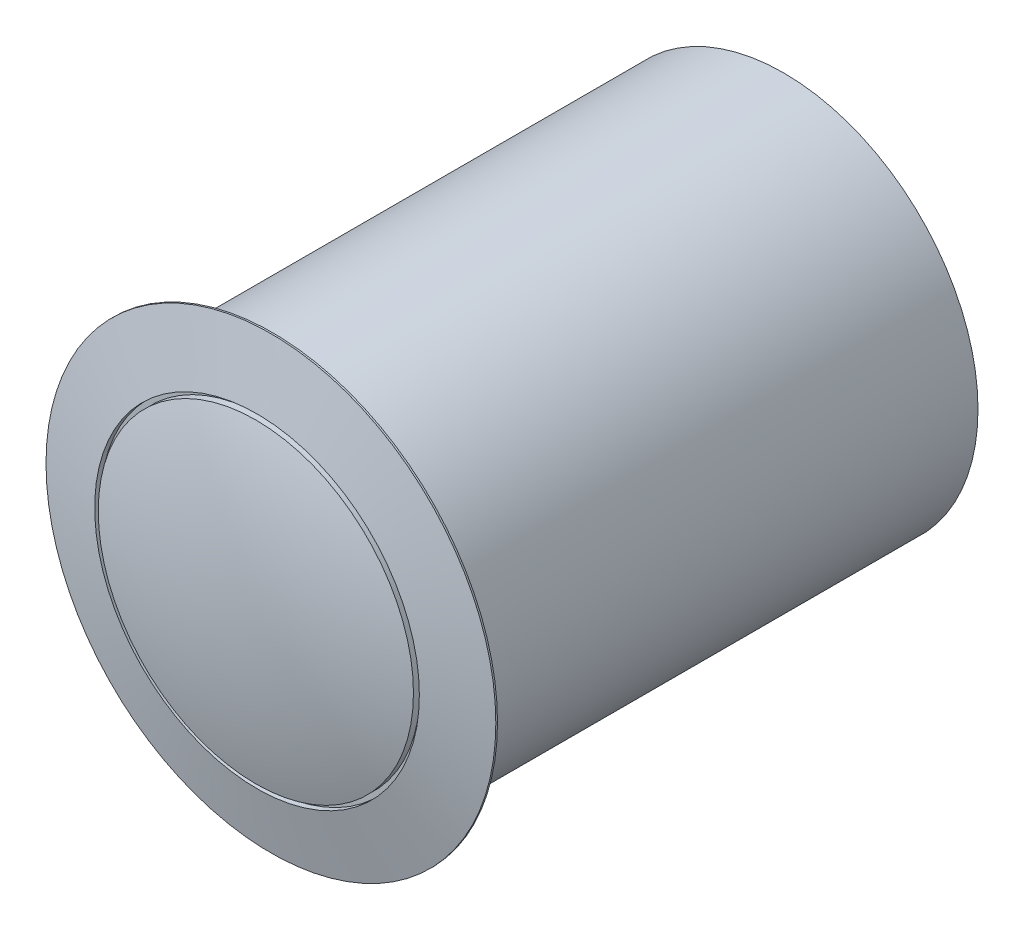
ISO-10303-21;
HEADER;
FILE_DESCRIPTION(('STEP AP214'),'2;1');
FILE_NAME('part.step','',(''),(''),'','','');
FILE_SCHEMA(('AUTOMOTIVE_DESIGN { 1 0 10303 214 1 1 1 1 }'));
ENDSEC;
DATA;
#1=APPLICATION_CONTEXT('core data for automotive mechanical design processes');
#2=APPLICATION_PROTOCOL_DEFINITION('international standard','automotive_design',2000,#1);
#3=PRODUCT_CONTEXT('',#1,'mechanical');
#4=PRODUCT('Part','Part','',(#3));
#5=PRODUCT_RELATED_PRODUCT_CATEGORY('part','',(#4));
#6=PRODUCT_DEFINITION_FORMATION('','',#4);
#7=PRODUCT_DEFINITION_CONTEXT('part definition',#1,'design');
#8=PRODUCT_DEFINITION('design','',#6,#7);
#9=PRODUCT_DEFINITION_SHAPE('','',#8);
#10=(LENGTH_UNIT() NAMED_UNIT(*) SI_UNIT(.MILLI.,.METRE.));
#11=(NAMED_UNIT(*) PLANE_ANGLE_UNIT() SI_UNIT($,.RADIAN.));
#12=(NAMED_UNIT(*) SI_UNIT($,.STERADIAN.) SOLID_ANGLE_UNIT());
#13=UNCERTAINTY_MEASURE_WITH_UNIT(LENGTH_MEASURE(1.E-05),#10,'distance_accuracy_value','');
#14=(GEOMETRIC_REPRESENTATION_CONTEXT(3) GLOBAL_UNCERTAINTY_ASSIGNED_CONTEXT((#13)) GLOBAL_UNIT_ASSIGNED_CONTEXT((#10,
#11,#12)) REPRESENTATION_CONTEXT('',''));
#15=CARTESIAN_POINT('',(0.,0.,0.));
#16=DIRECTION('',(0.,0.,1.));
#17=DIRECTION('',(1.,0.,0.));
#18=AXIS2_PLACEMENT_3D('',#15,#16,#17);
#19=CARTESIAN_POINT('',(0.,0.,3.38108067372266));
#20=DIRECTION('',(0.,0.,1.));
#21=DIRECTION('',(1.,0.,0.));
#22=AXIS2_PLACEMENT_3D('',#19,#20,#21);
#23=CYLINDRICAL_SURFACE('',#22,7.93920724566988);
#24=CARTESIAN_POINT('',(0.,0.,0.761243377894516));
#25=DIRECTION('',(0.,0.,1.));
#26=DIRECTION('',(1.,0.,0.));
#27=AXIS2_PLACEMENT_3D('',#24,#25,#26);
#28=CIRCLE('',#27,7.93920724566988);
#29=CARTESIAN_POINT('',(7.93920724566988,0.,0.761243377894516));
#30=VERTEX_POINT('',#29);
#31=EDGE_CURVE('E10',#30,#30,#28,.T.);
#32=ORIENTED_EDGE('',*,*,#31,.T.);
#33=EDGE_LOOP('',(#32));
#34=FACE_BOUND('',#33,.T.);
#35=CARTESIAN_POINT('',(0.,0.,0.488101593054619));
#36=DIRECTION('',(0.,0.,1.));
#37=DIRECTION('',(1.,0.,0.));
#38=AXIS2_PLACEMENT_3D('',#35,#36,#37);
#39=CIRCLE('',#38,7.93920724566988);
#40=CARTESIAN_POINT('',(7.93920724566988,0.,0.488101593054619));
#41=VERTEX_POINT('',#40);
#42=EDGE_CURVE('E59',#41,#41,#39,.T.);
#43=ORIENTED_EDGE('',*,*,#42,.F.);
#44=EDGE_LOOP('',(#43));
#45=FACE_BOUND('',#44,.T.);
#46=ADVANCED_FACE('F31',(#34,#45),#23,.F.);
#47=CARTESIAN_POINT('',(0.,0.,0.761243377894516));
#48=DIRECTION('',(0.,0.,-1.));
#49=DIRECTION('',(-1.,0.,0.));
#50=AXIS2_PLACEMENT_3D('',#47,#48,#49);
#51=CONICAL_SURFACE('',#50,7.93920724566988,1.35245152850808);
#52=CARTESIAN_POINT('',(0.,0.,0.0821082788888816));
#53=DIRECTION('',(0.,0.,1.));
#54=DIRECTION('',(1.,0.,0.));
#55=AXIS2_PLACEMENT_3D('',#52,#53,#54);
#56=CIRCLE('',#55,11.);
#57=CARTESIAN_POINT('',(11.,0.,0.0821082788888816));
#58=VERTEX_POINT('',#57);
#59=EDGE_CURVE('E37',#58,#58,#56,.T.);
#60=ORIENTED_EDGE('',*,*,#59,.T.);
#61=EDGE_LOOP('',(#60));
#62=FACE_BOUND('',#61,.T.);
#63=ORIENTED_EDGE('',*,*,#31,.F.);
#64=EDGE_LOOP('',(#63));
#65=FACE_BOUND('',#64,.T.);
#66=ADVANCED_FACE('F67',(#62,#65),#51,.T.);
#67=CARTESIAN_POINT('',(0.,0.,3.38108067372266));
#68=DIRECTION('',(0.,0.,1.));
#69=DIRECTION('',(1.,0.,0.));
#70=AXIS2_PLACEMENT_3D('',#67,#68,#69);
#71=CYLINDRICAL_SURFACE('',#70,11.);
#72=CARTESIAN_POINT('',(0.,0.,0.));
#73=DIRECTION('',(0.,0.,1.));
#74=DIRECTION('',(1.,0.,0.));
#75=AXIS2_PLACEMENT_3D('',#72,#73,#74);
#76=CIRCLE('',#75,11.);
#77=CARTESIAN_POINT('',(11.,0.,0.));
#78=VERTEX_POINT('',#77);
#79=EDGE_CURVE('E41',#78,#78,#76,.T.);
#80=ORIENTED_EDGE('',*,*,#79,.T.);
#81=EDGE_LOOP('',(#80));
#82=FACE_BOUND('',#81,.T.);
#83=ORIENTED_EDGE('',*,*,#59,.F.);
#84=EDGE_LOOP('',(#83));
#85=FACE_BOUND('',#84,.T.);
#86=ADVANCED_FACE('F71',(#82,#85),#71,.T.);
#87=CARTESIAN_POINT('',(11.,0.,0.));
#88=DIRECTION('',(0.,0.,-1.));
#89=DIRECTION('',(-1.,0.,0.));
#90=AXIS2_PLACEMENT_3D('',#87,#88,#89);
#91=PLANE('',#90);
#92=CARTESIAN_POINT('',(0.,0.,0.));
#93=DIRECTION('',(0.,0.,1.));
#94=DIRECTION('',(1.,0.,0.));
#95=AXIS2_PLACEMENT_3D('',#92,#93,#94);
#96=CIRCLE('',#95,9.5);
#97=CARTESIAN_POINT('',(9.5,0.,0.));
#98=VERTEX_POINT('',#97);
#99=EDGE_CURVE('E45',#98,#98,#96,.T.);
#100=ORIENTED_EDGE('',*,*,#99,.T.);
#101=EDGE_LOOP('',(#100));
#102=FACE_BOUND('',#101,.T.);
#103=ORIENTED_EDGE('',*,*,#79,.F.);
#104=EDGE_LOOP('',(#103));
#105=FACE_BOUND('',#104,.T.);
#106=ADVANCED_FACE('F75',(#102,#105),#91,.T.);
#107=CARTESIAN_POINT('',(0.,0.,3.38108067372266));
#108=DIRECTION('',(0.,0.,1.));
#109=DIRECTION('',(1.,0.,0.));
#110=AXIS2_PLACEMENT_3D('',#107,#108,#109);
#111=CYLINDRICAL_SURFACE('',#110,9.5);
#112=CARTESIAN_POINT('',(0.,0.,-25.));
#113=DIRECTION('',(0.,0.,1.));
#114=DIRECTION('',(1.,0.,0.));
#115=AXIS2_PLACEMENT_3D('',#112,#113,#114);
#116=CIRCLE('',#115,9.5);
#117=CARTESIAN_POINT('',(9.5,0.,-25.));
#118=VERTEX_POINT('',#117);
#119=EDGE_CURVE('E50',#118,#118,#116,.T.);
#120=ORIENTED_EDGE('',*,*,#119,.T.);
#121=EDGE_LOOP('',(#120));
#122=FACE_BOUND('',#121,.T.);
#123=ORIENTED_EDGE('',*,*,#99,.F.);
#124=EDGE_LOOP('',(#123));
#125=FACE_BOUND('',#124,.T.);
#126=ADVANCED_FACE('F82',(#122,#125),#111,.T.);
#127=CARTESIAN_POINT('',(9.5,0.,-25.));
#128=DIRECTION('',(0.,0.,-1.));
#129=DIRECTION('',(-1.,0.,0.));
#130=AXIS2_PLACEMENT_3D('',#127,#128,#129);
#131=PLANE('',#130);
#132=ORIENTED_EDGE('',*,*,#119,.F.);
#133=EDGE_LOOP('',(#132));
#134=FACE_BOUND('',#133,.T.);
#135=ADVANCED_FACE('F86',(#134),#131,.T.);
#136=CARTESIAN_POINT('',(0.,0.,-25.3726793022514));
#137=DIRECTION('',(0.,0.,1.));
#138=DIRECTION('',(1.,0.,0.));
#139=AXIS2_PLACEMENT_3D('',#136,#137,#138);
#140=SPHERICAL_SURFACE('',#139,27.3021569208723);
#141=CARTESIAN_POINT('',(0.,0.,0.818705260805179));
#142=DIRECTION('',(0.,0.,1.));
#143=DIRECTION('',(1.,0.,0.));
#144=AXIS2_PLACEMENT_3D('',#141,#142,#143);
#145=CIRCLE('',#144,7.70838162015986);
#146=CARTESIAN_POINT('',(7.70838162015986,0.,0.818705260805179));
#147=VERTEX_POINT('',#146);
#148=EDGE_CURVE('E53',#147,#147,#145,.T.);
#149=ORIENTED_EDGE('',*,*,#148,.T.);
#150=EDGE_LOOP('',(#149));
#151=FACE_BOUND('',#150,.T.);
#152=ADVANCED_FACE('F90',(#151),#140,.T.);
#153=CARTESIAN_POINT('',(0.,0.,3.38108067372266));
#154=DIRECTION('',(0.,0.,1.));
#155=DIRECTION('',(1.,0.,0.));
#156=AXIS2_PLACEMENT_3D('',#153,#154,#155);
#157=CYLINDRICAL_SURFACE('',#156,7.70838162015986);
#158=CARTESIAN_POINT('',(0.,0.,0.488101593054619));
#159=DIRECTION('',(0.,0.,1.));
#160=DIRECTION('',(1.,0.,0.));
#161=AXIS2_PLACEMENT_3D('',#158,#159,#160);
#162=CIRCLE('',#161,7.70838162015986);
#163=CARTESIAN_POINT('',(7.70838162015986,0.,0.488101593054619));
#164=VERTEX_POINT('',#163);
#165=EDGE_CURVE('E56',#164,#164,#162,.T.);
#166=ORIENTED_EDGE('',*,*,#165,.T.);
#167=EDGE_LOOP('',(#166));
#168=FACE_BOUND('',#167,.T.);
#169=ORIENTED_EDGE('',*,*,#148,.F.);
#170=EDGE_LOOP('',(#169));
#171=FACE_BOUND('',#170,.T.);
#172=ADVANCED_FACE('F94',(#168,#171),#157,.T.);
#173=CARTESIAN_POINT('',(7.93920724566988,0.,0.488101593054619));
#174=DIRECTION('',(0.,0.,1.));
#175=DIRECTION('',(1.,0.,0.));
#176=AXIS2_PLACEMENT_3D('',#173,#174,#175);
#177=PLANE('',#176);
#178=ORIENTED_EDGE('',*,*,#42,.T.);
#179=EDGE_LOOP('',(#178));
#180=FACE_BOUND('',#179,.T.);
#181=ORIENTED_EDGE('',*,*,#165,.F.);
#182=EDGE_LOOP('',(#181));
#183=FACE_BOUND('',#182,.T.);
#184=ADVANCED_FACE('F63',(#180,#183),#177,.T.);
#185=CLOSED_SHELL('',(#46,#66,#86,#106,#126,#135,#152,#172,#184));
#186=MANIFOLD_SOLID_BREP('B2',#185);
#187=ADVANCED_BREP_SHAPE_REPRESENTATION('',(#18,#186),#14);
#188=SHAPE_DEFINITION_REPRESENTATION(#9,#187);
ENDSEC;
END-ISO-10303-21;
